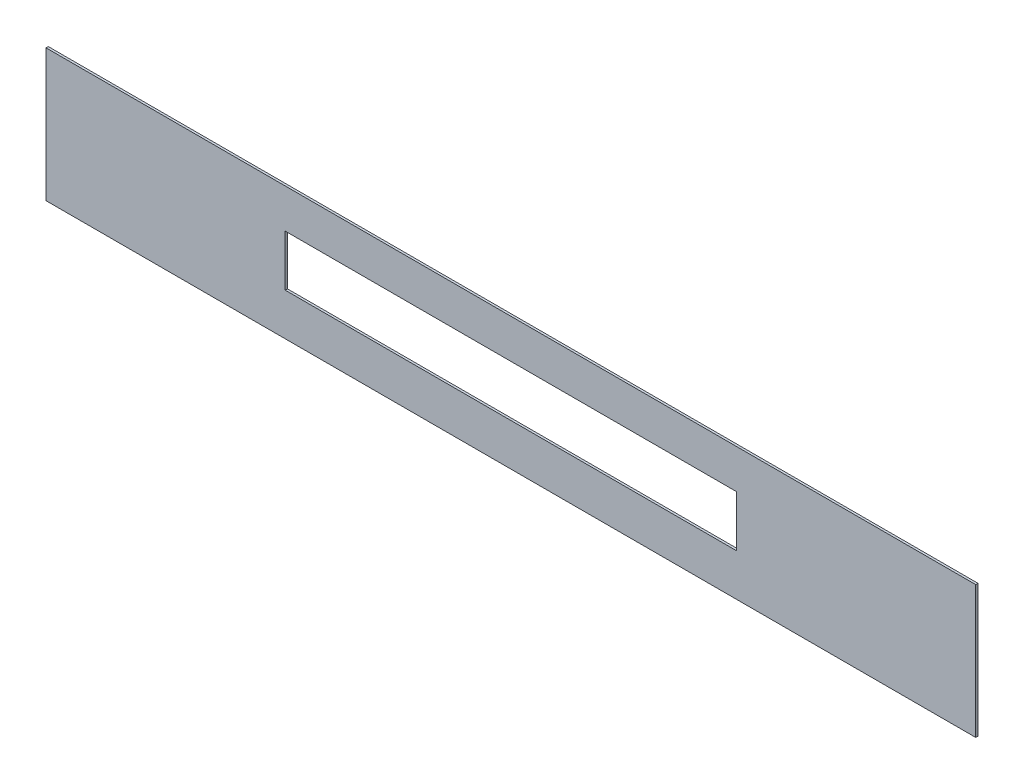
ISO-10303-21;
HEADER;
FILE_DESCRIPTION(('STEP AP214'),'2;1');
FILE_NAME('part.step','',(''),(''),'','','');
FILE_SCHEMA(('AUTOMOTIVE_DESIGN { 1 0 10303 214 1 1 1 1 }'));
ENDSEC;
DATA;
#1=APPLICATION_CONTEXT('core data for automotive mechanical design processes');
#2=APPLICATION_PROTOCOL_DEFINITION('international standard','automotive_design',2000,#1);
#3=PRODUCT_CONTEXT('',#1,'mechanical');
#4=PRODUCT('Part','Part','',(#3));
#5=PRODUCT_RELATED_PRODUCT_CATEGORY('part','',(#4));
#6=PRODUCT_DEFINITION_FORMATION('','',#4);
#7=PRODUCT_DEFINITION_CONTEXT('part definition',#1,'design');
#8=PRODUCT_DEFINITION('design','',#6,#7);
#9=PRODUCT_DEFINITION_SHAPE('','',#8);
#10=(LENGTH_UNIT() NAMED_UNIT(*) SI_UNIT(.MILLI.,.METRE.));
#11=(NAMED_UNIT(*) PLANE_ANGLE_UNIT() SI_UNIT($,.RADIAN.));
#12=(NAMED_UNIT(*) SI_UNIT($,.STERADIAN.) SOLID_ANGLE_UNIT());
#13=UNCERTAINTY_MEASURE_WITH_UNIT(LENGTH_MEASURE(1.E-05),#10,'distance_accuracy_value','');
#14=(GEOMETRIC_REPRESENTATION_CONTEXT(3) GLOBAL_UNCERTAINTY_ASSIGNED_CONTEXT((#13)) GLOBAL_UNIT_ASSIGNED_CONTEXT((#10,
#11,#12)) REPRESENTATION_CONTEXT('',''));
#15=CARTESIAN_POINT('',(0.,0.,0.));
#16=DIRECTION('',(0.,0.,1.));
#17=DIRECTION('',(1.,0.,0.));
#18=AXIS2_PLACEMENT_3D('',#15,#16,#17);
#19=CARTESIAN_POINT('',(0.,0.,40.));
#20=DIRECTION('',(0.,0.,-1.));
#21=DIRECTION('',(-1.,0.,0.));
#22=AXIS2_PLACEMENT_3D('',#19,#20,#21);
#23=PLANE('',#22);
#24=DIRECTION('',(0.,-1.,0.));
#25=VECTOR('',#24,1.);
#26=CARTESIAN_POINT('',(0.,0.,40.));
#27=LINE('',#26,#25);
#28=CARTESIAN_POINT('',(0.,88.,40.));
#29=VERTEX_POINT('',#28);
#30=CARTESIAN_POINT('',(0.,0.,40.));
#31=VERTEX_POINT('',#30);
#32=EDGE_CURVE('E126',#29,#31,#27,.T.);
#33=ORIENTED_EDGE('',*,*,#32,.T.);
#34=DIRECTION('',(1.,0.,0.));
#35=VECTOR('',#34,1.);
#36=CARTESIAN_POINT('',(0.,0.,40.));
#37=LINE('',#36,#35);
#38=CARTESIAN_POINT('',(618.,0.,40.));
#39=VERTEX_POINT('',#38);
#40=EDGE_CURVE('E129',#31,#39,#37,.T.);
#41=ORIENTED_EDGE('',*,*,#40,.T.);
#42=DIRECTION('',(0.,1.,0.));
#43=VECTOR('',#42,1.);
#44=CARTESIAN_POINT('',(618.,0.,40.));
#45=LINE('',#44,#43);
#46=CARTESIAN_POINT('',(618.,88.,40.));
#47=VERTEX_POINT('',#46);
#48=EDGE_CURVE('E132',#39,#47,#45,.T.);
#49=ORIENTED_EDGE('',*,*,#48,.T.);
#50=DIRECTION('',(-1.,0.,0.));
#51=VECTOR('',#50,1.);
#52=CARTESIAN_POINT('',(0.,88.,40.));
#53=LINE('',#52,#51);
#54=EDGE_CURVE('E134',#47,#29,#53,.T.);
#55=ORIENTED_EDGE('',*,*,#54,.T.);
#56=EDGE_LOOP('',(#33,#41,#49,#55));
#57=FACE_BOUND('',#56,.T.);
#58=DIRECTION('',(0.,-1.,0.));
#59=VECTOR('',#58,1.);
#60=CARTESIAN_POINT('',(159.,0.,40.));
#61=LINE('',#60,#59);
#62=CARTESIAN_POINT('',(159.,62.,40.));
#63=VERTEX_POINT('',#62);
#64=CARTESIAN_POINT('',(159.,28.,40.));
#65=VERTEX_POINT('',#64);
#66=EDGE_CURVE('E112',#63,#65,#61,.T.);
#67=ORIENTED_EDGE('',*,*,#66,.F.);
#68=DIRECTION('',(-1.,0.,0.));
#69=VECTOR('',#68,1.);
#70=CARTESIAN_POINT('',(0.,62.,40.));
#71=LINE('',#70,#69);
#72=CARTESIAN_POINT('',(459.,62.,40.));
#73=VERTEX_POINT('',#72);
#74=EDGE_CURVE('E101',#73,#63,#71,.T.);
#75=ORIENTED_EDGE('',*,*,#74,.F.);
#76=DIRECTION('',(0.,1.,0.));
#77=VECTOR('',#76,1.);
#78=CARTESIAN_POINT('',(459.,0.,40.));
#79=LINE('',#78,#77);
#80=CARTESIAN_POINT('',(459.,28.,40.));
#81=VERTEX_POINT('',#80);
#82=EDGE_CURVE('E106',#81,#73,#79,.T.);
#83=ORIENTED_EDGE('',*,*,#82,.F.);
#84=DIRECTION('',(1.,0.,0.));
#85=VECTOR('',#84,1.);
#86=CARTESIAN_POINT('',(0.,28.,40.));
#87=LINE('',#86,#85);
#88=EDGE_CURVE('E117',#65,#81,#87,.T.);
#89=ORIENTED_EDGE('',*,*,#88,.F.);
#90=EDGE_LOOP('',(#67,#75,#83,#89));
#91=FACE_BOUND('',#90,.T.);
#92=ADVANCED_FACE('F39',(#57,#91),#23,.F.);
#93=CARTESIAN_POINT('',(0.,0.,38.5));
#94=DIRECTION('',(0.,0.,-1.));
#95=DIRECTION('',(-1.,0.,0.));
#96=AXIS2_PLACEMENT_3D('',#93,#94,#95);
#97=PLANE('',#96);
#98=DIRECTION('',(0.,-1.,0.));
#99=VECTOR('',#98,1.);
#100=CARTESIAN_POINT('',(0.,0.,38.5));
#101=LINE('',#100,#99);
#102=CARTESIAN_POINT('',(0.,88.,38.5));
#103=VERTEX_POINT('',#102);
#104=CARTESIAN_POINT('',(0.,0.,38.5));
#105=VERTEX_POINT('',#104);
#106=EDGE_CURVE('E118',#103,#105,#101,.T.);
#107=ORIENTED_EDGE('',*,*,#106,.F.);
#108=DIRECTION('',(-1.,0.,0.));
#109=VECTOR('',#108,1.);
#110=CARTESIAN_POINT('',(0.,88.,38.5));
#111=LINE('',#110,#109);
#112=CARTESIAN_POINT('',(618.,88.,38.5));
#113=VERTEX_POINT('',#112);
#114=EDGE_CURVE('E130',#113,#103,#111,.T.);
#115=ORIENTED_EDGE('',*,*,#114,.F.);
#116=DIRECTION('',(0.,1.,0.));
#117=VECTOR('',#116,1.);
#118=CARTESIAN_POINT('',(618.,0.,38.5));
#119=LINE('',#118,#117);
#120=CARTESIAN_POINT('',(618.,0.,38.5));
#121=VERTEX_POINT('',#120);
#122=EDGE_CURVE('E138',#121,#113,#119,.T.);
#123=ORIENTED_EDGE('',*,*,#122,.F.);
#124=DIRECTION('',(1.,0.,0.));
#125=VECTOR('',#124,1.);
#126=CARTESIAN_POINT('',(0.,0.,38.5));
#127=LINE('',#126,#125);
#128=EDGE_CURVE('E121',#105,#121,#127,.T.);
#129=ORIENTED_EDGE('',*,*,#128,.F.);
#130=EDGE_LOOP('',(#107,#115,#123,#129));
#131=FACE_BOUND('',#130,.T.);
#132=DIRECTION('',(-1.,0.,0.));
#133=VECTOR('',#132,1.);
#134=CARTESIAN_POINT('',(0.,62.,38.5));
#135=LINE('',#134,#133);
#136=CARTESIAN_POINT('',(459.,62.,38.5));
#137=VERTEX_POINT('',#136);
#138=CARTESIAN_POINT('',(159.,62.,38.5));
#139=VERTEX_POINT('',#138);
#140=EDGE_CURVE('E152',#137,#139,#135,.T.);
#141=ORIENTED_EDGE('',*,*,#140,.T.);
#142=DIRECTION('',(0.,-1.,0.));
#143=VECTOR('',#142,1.);
#144=CARTESIAN_POINT('',(159.,0.,38.5));
#145=LINE('',#144,#143);
#146=CARTESIAN_POINT('',(159.,28.,38.5));
#147=VERTEX_POINT('',#146);
#148=EDGE_CURVE('E11',#139,#147,#145,.T.);
#149=ORIENTED_EDGE('',*,*,#148,.T.);
#150=DIRECTION('',(1.,0.,0.));
#151=VECTOR('',#150,1.);
#152=CARTESIAN_POINT('',(0.,28.,38.5));
#153=LINE('',#152,#151);
#154=CARTESIAN_POINT('',(459.,28.,38.5));
#155=VERTEX_POINT('',#154);
#156=EDGE_CURVE('E47',#147,#155,#153,.T.);
#157=ORIENTED_EDGE('',*,*,#156,.T.);
#158=DIRECTION('',(0.,1.,0.));
#159=VECTOR('',#158,1.);
#160=CARTESIAN_POINT('',(459.,0.,38.5));
#161=LINE('',#160,#159);
#162=EDGE_CURVE('E154',#155,#137,#161,.T.);
#163=ORIENTED_EDGE('',*,*,#162,.T.);
#164=EDGE_LOOP('',(#141,#149,#157,#163));
#165=FACE_BOUND('',#164,.T.);
#166=ADVANCED_FACE('F158',(#131,#165),#97,.T.);
#167=CARTESIAN_POINT('',(0.,0.,40.));
#168=DIRECTION('',(1.,0.,0.));
#169=DIRECTION('',(0.,0.,-1.));
#170=AXIS2_PLACEMENT_3D('',#167,#168,#169);
#171=PLANE('',#170);
#172=ORIENTED_EDGE('',*,*,#106,.T.);
#173=DIRECTION('',(0.,0.,-1.));
#174=VECTOR('',#173,1.);
#175=CARTESIAN_POINT('',(0.,0.,40.));
#176=LINE('',#175,#174);
#177=EDGE_CURVE('E149',#31,#105,#176,.T.);
#178=ORIENTED_EDGE('',*,*,#177,.F.);
#179=ORIENTED_EDGE('',*,*,#32,.F.);
#180=DIRECTION('',(0.,0.,-1.));
#181=VECTOR('',#180,1.);
#182=CARTESIAN_POINT('',(0.,88.,40.));
#183=LINE('',#182,#181);
#184=EDGE_CURVE('E135',#29,#103,#183,.T.);
#185=ORIENTED_EDGE('',*,*,#184,.T.);
#186=EDGE_LOOP('',(#172,#178,#179,#185));
#187=FACE_BOUND('',#186,.T.);
#188=ADVANCED_FACE('F41',(#187),#171,.F.);
#189=CARTESIAN_POINT('',(0.,0.,40.));
#190=DIRECTION('',(0.,1.,0.));
#191=DIRECTION('',(0.,0.,1.));
#192=AXIS2_PLACEMENT_3D('',#189,#190,#191);
#193=PLANE('',#192);
#194=ORIENTED_EDGE('',*,*,#128,.T.);
#195=DIRECTION('',(0.,0.,-1.));
#196=VECTOR('',#195,1.);
#197=CARTESIAN_POINT('',(618.,0.,40.));
#198=LINE('',#197,#196);
#199=EDGE_CURVE('E146',#39,#121,#198,.T.);
#200=ORIENTED_EDGE('',*,*,#199,.F.);
#201=ORIENTED_EDGE('',*,*,#40,.F.);
#202=ORIENTED_EDGE('',*,*,#177,.T.);
#203=EDGE_LOOP('',(#194,#200,#201,#202));
#204=FACE_BOUND('',#203,.T.);
#205=ADVANCED_FACE('F193',(#204),#193,.F.);
#206=CARTESIAN_POINT('',(618.,0.,40.));
#207=DIRECTION('',(-1.,0.,0.));
#208=DIRECTION('',(0.,0.,1.));
#209=AXIS2_PLACEMENT_3D('',#206,#207,#208);
#210=PLANE('',#209);
#211=ORIENTED_EDGE('',*,*,#122,.T.);
#212=DIRECTION('',(0.,0.,-1.));
#213=VECTOR('',#212,1.);
#214=CARTESIAN_POINT('',(618.,88.,40.));
#215=LINE('',#214,#213);
#216=EDGE_CURVE('E143',#47,#113,#215,.T.);
#217=ORIENTED_EDGE('',*,*,#216,.F.);
#218=ORIENTED_EDGE('',*,*,#48,.F.);
#219=ORIENTED_EDGE('',*,*,#199,.T.);
#220=EDGE_LOOP('',(#211,#217,#218,#219));
#221=FACE_BOUND('',#220,.T.);
#222=ADVANCED_FACE('F190',(#221),#210,.F.);
#223=CARTESIAN_POINT('',(0.,88.,40.));
#224=DIRECTION('',(0.,-1.,0.));
#225=DIRECTION('',(0.,0.,-1.));
#226=AXIS2_PLACEMENT_3D('',#223,#224,#225);
#227=PLANE('',#226);
#228=ORIENTED_EDGE('',*,*,#114,.T.);
#229=ORIENTED_EDGE('',*,*,#184,.F.);
#230=ORIENTED_EDGE('',*,*,#54,.F.);
#231=ORIENTED_EDGE('',*,*,#216,.T.);
#232=EDGE_LOOP('',(#228,#229,#230,#231));
#233=FACE_BOUND('',#232,.T.);
#234=ADVANCED_FACE('F188',(#233),#227,.F.);
#235=CARTESIAN_POINT('',(159.,28.,41.));
#236=DIRECTION('',(1.,0.,0.));
#237=DIRECTION('',(0.,0.,-1.));
#238=AXIS2_PLACEMENT_3D('',#235,#236,#237);
#239=PLANE('',#238);
#240=ORIENTED_EDGE('',*,*,#66,.T.);
#241=DIRECTION('',(0.,0.,-1.));
#242=VECTOR('',#241,1.);
#243=CARTESIAN_POINT('',(159.,28.,41.));
#244=LINE('',#243,#242);
#245=EDGE_CURVE('E107',#65,#147,#244,.T.);
#246=ORIENTED_EDGE('',*,*,#245,.T.);
#247=ORIENTED_EDGE('',*,*,#148,.F.);
#248=DIRECTION('',(0.,0.,-1.));
#249=VECTOR('',#248,1.);
#250=CARTESIAN_POINT('',(159.,62.,41.));
#251=LINE('',#250,#249);
#252=EDGE_CURVE('E59',#63,#139,#251,.T.);
#253=ORIENTED_EDGE('',*,*,#252,.F.);
#254=EDGE_LOOP('',(#240,#246,#247,#253));
#255=FACE_BOUND('',#254,.T.);
#256=ADVANCED_FACE('F110',(#255),#239,.T.);
#257=CARTESIAN_POINT('',(159.,28.,41.));
#258=DIRECTION('',(0.,1.,0.));
#259=DIRECTION('',(0.,0.,1.));
#260=AXIS2_PLACEMENT_3D('',#257,#258,#259);
#261=PLANE('',#260);
#262=ORIENTED_EDGE('',*,*,#88,.T.);
#263=DIRECTION('',(0.,0.,-1.));
#264=VECTOR('',#263,1.);
#265=CARTESIAN_POINT('',(459.,28.,41.));
#266=LINE('',#265,#264);
#267=EDGE_CURVE('E163',#81,#155,#266,.T.);
#268=ORIENTED_EDGE('',*,*,#267,.T.);
#269=ORIENTED_EDGE('',*,*,#156,.F.);
#270=ORIENTED_EDGE('',*,*,#245,.F.);
#271=EDGE_LOOP('',(#262,#268,#269,#270));
#272=FACE_BOUND('',#271,.T.);
#273=ADVANCED_FACE('F161',(#272),#261,.T.);
#274=CARTESIAN_POINT('',(459.,28.,41.));
#275=DIRECTION('',(-1.,0.,0.));
#276=DIRECTION('',(0.,0.,1.));
#277=AXIS2_PLACEMENT_3D('',#274,#275,#276);
#278=PLANE('',#277);
#279=ORIENTED_EDGE('',*,*,#82,.T.);
#280=DIRECTION('',(0.,0.,-1.));
#281=VECTOR('',#280,1.);
#282=CARTESIAN_POINT('',(459.,62.,41.));
#283=LINE('',#282,#281);
#284=EDGE_CURVE('E54',#73,#137,#283,.T.);
#285=ORIENTED_EDGE('',*,*,#284,.T.);
#286=ORIENTED_EDGE('',*,*,#162,.F.);
#287=ORIENTED_EDGE('',*,*,#267,.F.);
#288=EDGE_LOOP('',(#279,#285,#286,#287));
#289=FACE_BOUND('',#288,.T.);
#290=ADVANCED_FACE('F168',(#289),#278,.T.);
#291=CARTESIAN_POINT('',(159.,62.,41.));
#292=DIRECTION('',(0.,-1.,0.));
#293=DIRECTION('',(0.,0.,-1.));
#294=AXIS2_PLACEMENT_3D('',#291,#292,#293);
#295=PLANE('',#294);
#296=ORIENTED_EDGE('',*,*,#74,.T.);
#297=ORIENTED_EDGE('',*,*,#252,.T.);
#298=ORIENTED_EDGE('',*,*,#140,.F.);
#299=ORIENTED_EDGE('',*,*,#284,.F.);
#300=EDGE_LOOP('',(#296,#297,#298,#299));
#301=FACE_BOUND('',#300,.T.);
#302=ADVANCED_FACE('F102',(#301),#295,.T.);
#303=CLOSED_SHELL('',(#92,#166,#188,#205,#222,#234,#256,#273,#290,#302));
#304=MANIFOLD_SOLID_BREP('B2',#303);
#305=ADVANCED_BREP_SHAPE_REPRESENTATION('',(#18,#304),#14);
#306=SHAPE_DEFINITION_REPRESENTATION(#9,#305);
ENDSEC;
END-ISO-10303-21;
